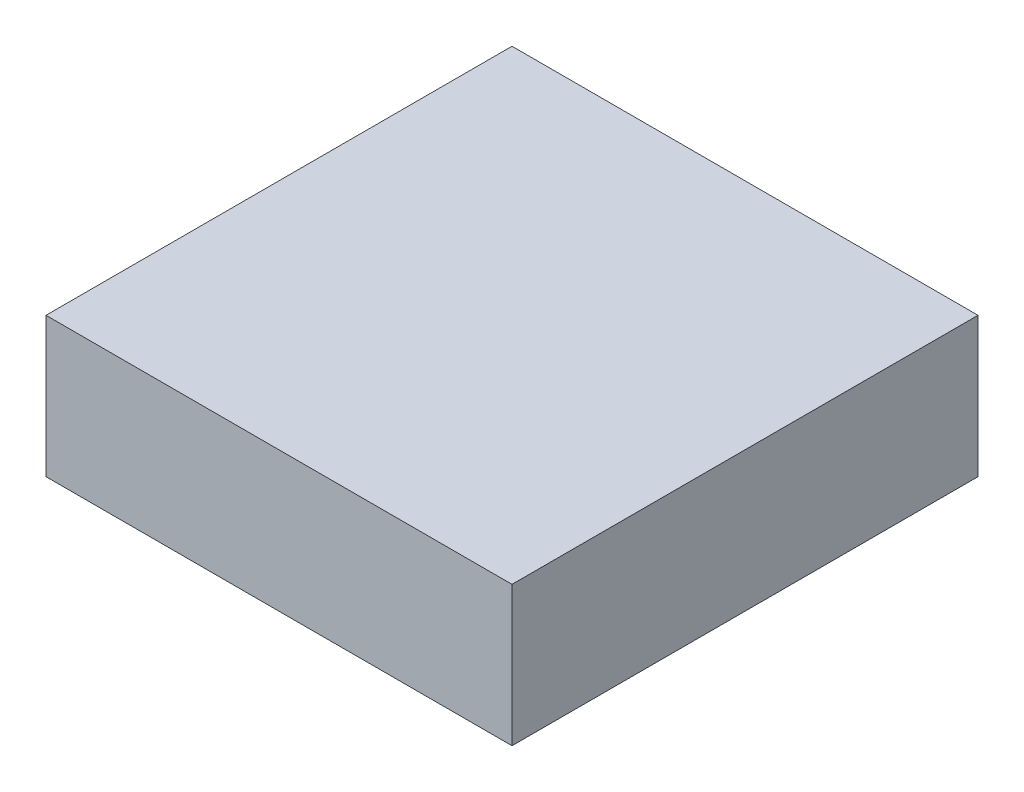
ISO-10303-21;
HEADER;
FILE_DESCRIPTION(('STEP AP214'),'2;1');
FILE_NAME('part.step','',(''),(''),'','','');
FILE_SCHEMA(('AUTOMOTIVE_DESIGN { 1 0 10303 214 1 1 1 1 }'));
ENDSEC;
DATA;
#1=APPLICATION_CONTEXT('core data for automotive mechanical design processes');
#2=APPLICATION_PROTOCOL_DEFINITION('international standard','automotive_design',2000,#1);
#3=PRODUCT_CONTEXT('',#1,'mechanical');
#4=PRODUCT('Part','Part','',(#3));
#5=PRODUCT_RELATED_PRODUCT_CATEGORY('part','',(#4));
#6=PRODUCT_DEFINITION_FORMATION('','',#4);
#7=PRODUCT_DEFINITION_CONTEXT('part definition',#1,'design');
#8=PRODUCT_DEFINITION('design','',#6,#7);
#9=PRODUCT_DEFINITION_SHAPE('','',#8);
#10=(LENGTH_UNIT() NAMED_UNIT(*) SI_UNIT(.MILLI.,.METRE.));
#11=(NAMED_UNIT(*) PLANE_ANGLE_UNIT() SI_UNIT($,.RADIAN.));
#12=(NAMED_UNIT(*) SI_UNIT($,.STERADIAN.) SOLID_ANGLE_UNIT());
#13=UNCERTAINTY_MEASURE_WITH_UNIT(LENGTH_MEASURE(1.E-05),#10,'distance_accuracy_value','');
#14=(GEOMETRIC_REPRESENTATION_CONTEXT(3) GLOBAL_UNCERTAINTY_ASSIGNED_CONTEXT((#13)) GLOBAL_UNIT_ASSIGNED_CONTEXT((#10,
#11,#12)) REPRESENTATION_CONTEXT('',''));
#15=CARTESIAN_POINT('',(0.,0.,0.));
#16=DIRECTION('',(0.,0.,1.));
#17=DIRECTION('',(1.,0.,0.));
#18=AXIS2_PLACEMENT_3D('',#15,#16,#17);
#19=CARTESIAN_POINT('',(0.,0.75,0.));
#20=DIRECTION('',(0.,-1.,0.));
#21=DIRECTION('',(0.,0.,-1.));
#22=AXIS2_PLACEMENT_3D('',#19,#20,#21);
#23=PLANE('',#22);
#24=DIRECTION('',(1.,0.,0.));
#25=VECTOR('',#24,1.);
#26=CARTESIAN_POINT('',(-1.25,0.75,-1.25));
#27=LINE('',#26,#25);
#28=CARTESIAN_POINT('',(1.25,0.75,-1.25));
#29=VERTEX_POINT('',#28);
#30=CARTESIAN_POINT('',(-1.25,0.75,-1.25));
#31=VERTEX_POINT('',#30);
#32=EDGE_CURVE('E80',#29,#31,#27,.F.);
#33=ORIENTED_EDGE('',*,*,#32,.T.);
#34=DIRECTION('',(0.,0.,-1.));
#35=VECTOR('',#34,1.);
#36=CARTESIAN_POINT('',(-1.25,0.75,1.25));
#37=LINE('',#36,#35);
#38=CARTESIAN_POINT('',(-1.25,0.75,1.25));
#39=VERTEX_POINT('',#38);
#40=EDGE_CURVE('E55',#31,#39,#37,.F.);
#41=ORIENTED_EDGE('',*,*,#40,.T.);
#42=DIRECTION('',(-1.,0.,0.));
#43=VECTOR('',#42,1.);
#44=CARTESIAN_POINT('',(-1.25,0.75,1.25));
#45=LINE('',#44,#43);
#46=CARTESIAN_POINT('',(1.25,0.75,1.25));
#47=VERTEX_POINT('',#46);
#48=EDGE_CURVE('E57',#39,#47,#45,.F.);
#49=ORIENTED_EDGE('',*,*,#48,.T.);
#50=DIRECTION('',(0.,0.,1.));
#51=VECTOR('',#50,1.);
#52=CARTESIAN_POINT('',(1.25,0.75,1.25));
#53=LINE('',#52,#51);
#54=EDGE_CURVE('E20',#47,#29,#53,.F.);
#55=ORIENTED_EDGE('',*,*,#54,.T.);
#56=EDGE_LOOP('',(#33,#41,#49,#55));
#57=FACE_BOUND('',#56,.T.);
#58=ADVANCED_FACE('F17',(#57),#23,.F.);
#59=CARTESIAN_POINT('',(1.25,0.75,1.25));
#60=DIRECTION('',(-1.,0.,0.));
#61=DIRECTION('',(0.,0.,1.));
#62=AXIS2_PLACEMENT_3D('',#59,#60,#61);
#63=PLANE('',#62);
#64=DIRECTION('',(0.,1.,0.));
#65=VECTOR('',#64,1.);
#66=CARTESIAN_POINT('',(1.25,0.75,-1.25));
#67=LINE('',#66,#65);
#68=CARTESIAN_POINT('',(1.25,0.,-1.25));
#69=VERTEX_POINT('',#68);
#70=EDGE_CURVE('E68',#69,#29,#67,.T.);
#71=ORIENTED_EDGE('',*,*,#70,.T.);
#72=ORIENTED_EDGE('',*,*,#54,.F.);
#73=DIRECTION('',(0.,1.,0.));
#74=VECTOR('',#73,1.);
#75=CARTESIAN_POINT('',(1.25,0.75,1.25));
#76=LINE('',#75,#74);
#77=CARTESIAN_POINT('',(1.25,0.,1.25));
#78=VERTEX_POINT('',#77);
#79=EDGE_CURVE('E63',#47,#78,#76,.F.);
#80=ORIENTED_EDGE('',*,*,#79,.T.);
#81=DIRECTION('',(0.,0.,-1.));
#82=VECTOR('',#81,1.);
#83=CARTESIAN_POINT('',(1.25,0.,0.));
#84=LINE('',#83,#82);
#85=EDGE_CURVE('E83',#69,#78,#84,.F.);
#86=ORIENTED_EDGE('',*,*,#85,.F.);
#87=EDGE_LOOP('',(#71,#72,#80,#86));
#88=FACE_BOUND('',#87,.T.);
#89=ADVANCED_FACE('F65',(#88),#63,.F.);
#90=CARTESIAN_POINT('',(-1.25,0.75,1.25));
#91=DIRECTION('',(0.,0.,-1.));
#92=DIRECTION('',(-1.,0.,0.));
#93=AXIS2_PLACEMENT_3D('',#90,#91,#92);
#94=PLANE('',#93);
#95=ORIENTED_EDGE('',*,*,#79,.F.);
#96=ORIENTED_EDGE('',*,*,#48,.F.);
#97=DIRECTION('',(0.,1.,0.));
#98=VECTOR('',#97,1.);
#99=CARTESIAN_POINT('',(-1.25,0.75,1.25));
#100=LINE('',#99,#98);
#101=CARTESIAN_POINT('',(-1.25,0.,1.25));
#102=VERTEX_POINT('',#101);
#103=EDGE_CURVE('E75',#39,#102,#100,.F.);
#104=ORIENTED_EDGE('',*,*,#103,.T.);
#105=DIRECTION('',(1.,0.,0.));
#106=VECTOR('',#105,1.);
#107=CARTESIAN_POINT('',(0.,0.,1.25));
#108=LINE('',#107,#106);
#109=EDGE_CURVE('E72',#78,#102,#108,.F.);
#110=ORIENTED_EDGE('',*,*,#109,.F.);
#111=EDGE_LOOP('',(#95,#96,#104,#110));
#112=FACE_BOUND('',#111,.T.);
#113=ADVANCED_FACE('F70',(#112),#94,.F.);
#114=CARTESIAN_POINT('',(-1.25,0.75,1.25));
#115=DIRECTION('',(1.,0.,0.));
#116=DIRECTION('',(0.,0.,-1.));
#117=AXIS2_PLACEMENT_3D('',#114,#115,#116);
#118=PLANE('',#117);
#119=ORIENTED_EDGE('',*,*,#103,.F.);
#120=ORIENTED_EDGE('',*,*,#40,.F.);
#121=DIRECTION('',(0.,1.,0.));
#122=VECTOR('',#121,1.);
#123=CARTESIAN_POINT('',(-1.25,0.75,-1.25));
#124=LINE('',#123,#122);
#125=CARTESIAN_POINT('',(-1.25,0.,-1.25));
#126=VERTEX_POINT('',#125);
#127=EDGE_CURVE('E35',#31,#126,#124,.F.);
#128=ORIENTED_EDGE('',*,*,#127,.T.);
#129=DIRECTION('',(0.,0.,-1.));
#130=VECTOR('',#129,1.);
#131=CARTESIAN_POINT('',(-1.25,0.,0.));
#132=LINE('',#131,#130);
#133=EDGE_CURVE('E26',#102,#126,#132,.T.);
#134=ORIENTED_EDGE('',*,*,#133,.F.);
#135=EDGE_LOOP('',(#119,#120,#128,#134));
#136=FACE_BOUND('',#135,.T.);
#137=ADVANCED_FACE('F89',(#136),#118,.F.);
#138=CARTESIAN_POINT('',(-1.25,0.75,-1.25));
#139=DIRECTION('',(0.,0.,1.));
#140=DIRECTION('',(1.,0.,0.));
#141=AXIS2_PLACEMENT_3D('',#138,#139,#140);
#142=PLANE('',#141);
#143=ORIENTED_EDGE('',*,*,#127,.F.);
#144=ORIENTED_EDGE('',*,*,#32,.F.);
#145=ORIENTED_EDGE('',*,*,#70,.F.);
#146=DIRECTION('',(1.,0.,0.));
#147=VECTOR('',#146,1.);
#148=CARTESIAN_POINT('',(0.,0.,-1.25));
#149=LINE('',#148,#147);
#150=EDGE_CURVE('E11',#126,#69,#149,.T.);
#151=ORIENTED_EDGE('',*,*,#150,.F.);
#152=EDGE_LOOP('',(#143,#144,#145,#151));
#153=FACE_BOUND('',#152,.T.);
#154=ADVANCED_FACE('F91',(#153),#142,.F.);
#155=CARTESIAN_POINT('',(0.,0.,0.));
#156=DIRECTION('',(0.,-1.,0.));
#157=DIRECTION('',(0.,0.,-1.));
#158=AXIS2_PLACEMENT_3D('',#155,#156,#157);
#159=PLANE('',#158);
#160=ORIENTED_EDGE('',*,*,#133,.T.);
#161=ORIENTED_EDGE('',*,*,#150,.T.);
#162=ORIENTED_EDGE('',*,*,#85,.T.);
#163=ORIENTED_EDGE('',*,*,#109,.T.);
#164=EDGE_LOOP('',(#160,#161,#162,#163));
#165=FACE_BOUND('',#164,.T.);
#166=ADVANCED_FACE('F88',(#165),#159,.T.);
#167=CLOSED_SHELL('',(#58,#89,#113,#137,#154,#166));
#168=MANIFOLD_SOLID_BREP('B1',#167);
#169=ADVANCED_BREP_SHAPE_REPRESENTATION('',(#18,#168),#14);
#170=SHAPE_DEFINITION_REPRESENTATION(#9,#169);
ENDSEC;
END-ISO-10303-21;
